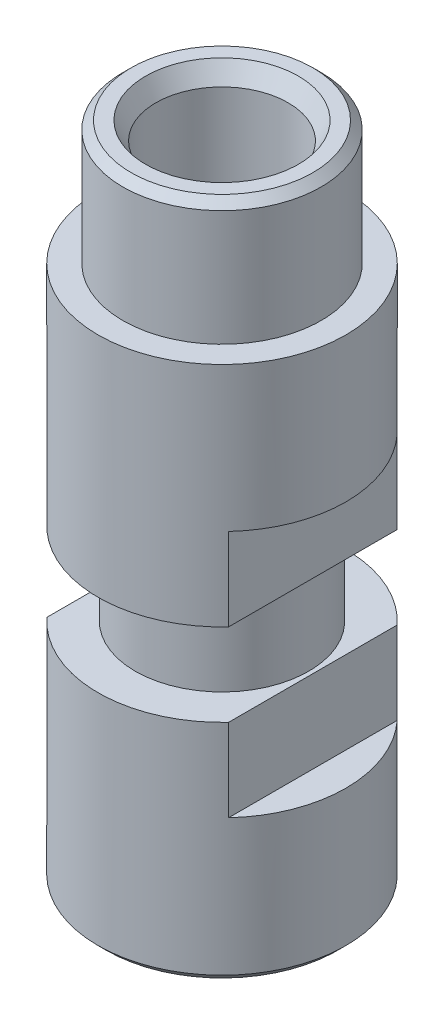
ISO-10303-21;
HEADER;
FILE_DESCRIPTION(('STEP AP214'),'2;1');
FILE_NAME('part.step','',(''),(''),'','','');
FILE_SCHEMA(('AUTOMOTIVE_DESIGN { 1 0 10303 214 1 1 1 1 }'));
ENDSEC;
DATA;
#1=APPLICATION_CONTEXT('core data for automotive mechanical design processes');
#2=APPLICATION_PROTOCOL_DEFINITION('international standard','automotive_design',2000,#1);
#3=PRODUCT_CONTEXT('',#1,'mechanical');
#4=PRODUCT('Part','Part','',(#3));
#5=PRODUCT_RELATED_PRODUCT_CATEGORY('part','',(#4));
#6=PRODUCT_DEFINITION_FORMATION('','',#4);
#7=PRODUCT_DEFINITION_CONTEXT('part definition',#1,'design');
#8=PRODUCT_DEFINITION('design','',#6,#7);
#9=PRODUCT_DEFINITION_SHAPE('','',#8);
#10=(LENGTH_UNIT() NAMED_UNIT(*) SI_UNIT(.MILLI.,.METRE.));
#11=(NAMED_UNIT(*) PLANE_ANGLE_UNIT() SI_UNIT($,.RADIAN.));
#12=(NAMED_UNIT(*) SI_UNIT($,.STERADIAN.) SOLID_ANGLE_UNIT());
#13=UNCERTAINTY_MEASURE_WITH_UNIT(LENGTH_MEASURE(1.E-05),#10,'distance_accuracy_value','');
#14=(GEOMETRIC_REPRESENTATION_CONTEXT(3) GLOBAL_UNCERTAINTY_ASSIGNED_CONTEXT((#13)) GLOBAL_UNIT_ASSIGNED_CONTEXT((#10,
#11,#12)) REPRESENTATION_CONTEXT('',''));
#15=CARTESIAN_POINT('',(0.,0.,0.));
#16=DIRECTION('',(0.,0.,1.));
#17=DIRECTION('',(1.,0.,0.));
#18=AXIS2_PLACEMENT_3D('',#15,#16,#17);
#19=CARTESIAN_POINT('',(-3.,0.,0.));
#20=DIRECTION('',(0.,1.,0.));
#21=DIRECTION('',(0.,0.,1.));
#22=AXIS2_PLACEMENT_3D('',#19,#20,#21);
#23=PLANE('',#22);
#24=CARTESIAN_POINT('',(0.,0.,0.));
#25=DIRECTION('',(0.,1.,0.));
#26=DIRECTION('',(0.,0.,1.));
#27=AXIS2_PLACEMENT_3D('',#24,#25,#26);
#28=CIRCLE('',#27,2.8);
#29=CARTESIAN_POINT('',(0.,0.,2.8));
#30=VERTEX_POINT('',#29);
#31=EDGE_CURVE('E143',#30,#30,#28,.F.);
#32=ORIENTED_EDGE('',*,*,#31,.T.);
#33=EDGE_LOOP('',(#32));
#34=FACE_BOUND('',#33,.T.);
#35=CARTESIAN_POINT('',(0.,0.,0.));
#36=DIRECTION('',(0.,-1.,0.));
#37=DIRECTION('',(0.,0.,-1.));
#38=AXIS2_PLACEMENT_3D('',#35,#36,#37);
#39=CIRCLE('',#38,1.6);
#40=CARTESIAN_POINT('',(0.,0.,-1.6));
#41=VERTEX_POINT('',#40);
#42=EDGE_CURVE('E146',#41,#41,#39,.T.);
#43=ORIENTED_EDGE('',*,*,#42,.F.);
#44=EDGE_LOOP('',(#43));
#45=FACE_BOUND('',#44,.T.);
#46=ADVANCED_FACE('F34',(#34,#45),#23,.F.);
#47=CARTESIAN_POINT('',(0.,0.,0.));
#48=DIRECTION('',(0.,-1.,0.));
#49=DIRECTION('',(0.,0.,-1.));
#50=AXIS2_PLACEMENT_3D('',#47,#48,#49);
#51=CYLINDRICAL_SURFACE('',#50,1.6);
#52=CARTESIAN_POINT('',(0.,15.5669872981078,0.));
#53=DIRECTION('',(0.,-1.,0.));
#54=DIRECTION('',(0.,0.,-1.));
#55=AXIS2_PLACEMENT_3D('',#52,#53,#54);
#56=CIRCLE('',#55,1.6);
#57=CARTESIAN_POINT('',(0.,15.5669872981078,-1.6));
#58=VERTEX_POINT('',#57);
#59=EDGE_CURVE('E128',#58,#58,#56,.F.);
#60=ORIENTED_EDGE('',*,*,#59,.T.);
#61=EDGE_LOOP('',(#60));
#62=FACE_BOUND('',#61,.T.);
#63=ORIENTED_EDGE('',*,*,#42,.T.);
#64=EDGE_LOOP('',(#63));
#65=FACE_BOUND('',#64,.T.);
#66=ADVANCED_FACE('F222',(#62,#65),#51,.F.);
#67=CARTESIAN_POINT('',(-1.6,16.,0.));
#68=DIRECTION('',(0.,-1.,0.));
#69=DIRECTION('',(0.,0.,-1.));
#70=AXIS2_PLACEMENT_3D('',#67,#68,#69);
#71=PLANE('',#70);
#72=CARTESIAN_POINT('',(0.,16.,0.));
#73=DIRECTION('',(0.,-1.,0.));
#74=DIRECTION('',(0.,0.,-1.));
#75=AXIS2_PLACEMENT_3D('',#72,#73,#74);
#76=CIRCLE('',#75,1.85);
#77=CARTESIAN_POINT('',(0.,16.,-1.85));
#78=VERTEX_POINT('',#77);
#79=EDGE_CURVE('E131',#78,#78,#76,.T.);
#80=ORIENTED_EDGE('',*,*,#79,.T.);
#81=EDGE_LOOP('',(#80));
#82=FACE_BOUND('',#81,.T.);
#83=CARTESIAN_POINT('',(0.,16.,0.));
#84=DIRECTION('',(0.,-1.,0.));
#85=DIRECTION('',(0.,0.,-1.));
#86=AXIS2_PLACEMENT_3D('',#83,#84,#85);
#87=CIRCLE('',#86,2.2);
#88=CARTESIAN_POINT('',(0.,16.,-2.2));
#89=VERTEX_POINT('',#88);
#90=EDGE_CURVE('E134',#89,#89,#87,.F.);
#91=ORIENTED_EDGE('',*,*,#90,.T.);
#92=EDGE_LOOP('',(#91));
#93=FACE_BOUND('',#92,.T.);
#94=ADVANCED_FACE('F228',(#82,#93),#71,.F.);
#95=CARTESIAN_POINT('',(0.,0.,0.));
#96=DIRECTION('',(0.,-1.,0.));
#97=DIRECTION('',(0.,0.,-1.));
#98=AXIS2_PLACEMENT_3D('',#95,#96,#97);
#99=CYLINDRICAL_SURFACE('',#98,2.4);
#100=CARTESIAN_POINT('',(0.,15.8,0.));
#101=DIRECTION('',(0.,-1.,0.));
#102=DIRECTION('',(0.,0.,-1.));
#103=AXIS2_PLACEMENT_3D('',#100,#101,#102);
#104=CIRCLE('',#103,2.4);
#105=CARTESIAN_POINT('',(0.,15.8,-2.4));
#106=VERTEX_POINT('',#105);
#107=EDGE_CURVE('E137',#106,#106,#104,.T.);
#108=ORIENTED_EDGE('',*,*,#107,.T.);
#109=EDGE_LOOP('',(#108));
#110=FACE_BOUND('',#109,.T.);
#111=CARTESIAN_POINT('',(0.,13.,0.));
#112=DIRECTION('',(0.,-1.,0.));
#113=DIRECTION('',(0.,0.,-1.));
#114=AXIS2_PLACEMENT_3D('',#111,#112,#113);
#115=CIRCLE('',#114,2.4);
#116=CARTESIAN_POINT('',(0.,13.,-2.4));
#117=VERTEX_POINT('',#116);
#118=EDGE_CURVE('E149',#117,#117,#115,.T.);
#119=ORIENTED_EDGE('',*,*,#118,.F.);
#120=EDGE_LOOP('',(#119));
#121=FACE_BOUND('',#120,.T.);
#122=ADVANCED_FACE('F248',(#110,#121),#99,.T.);
#123=CARTESIAN_POINT('',(-2.4,13.,0.));
#124=DIRECTION('',(0.,-1.,0.));
#125=DIRECTION('',(0.,0.,-1.));
#126=AXIS2_PLACEMENT_3D('',#123,#124,#125);
#127=PLANE('',#126);
#128=CARTESIAN_POINT('',(0.,13.,0.));
#129=DIRECTION('',(0.,-1.,0.));
#130=DIRECTION('',(0.,0.,-1.));
#131=AXIS2_PLACEMENT_3D('',#128,#129,#130);
#132=CIRCLE('',#131,3.);
#133=CARTESIAN_POINT('',(0.,13.,-3.));
#134=VERTEX_POINT('',#133);
#135=EDGE_CURVE('E152',#134,#134,#132,.T.);
#136=ORIENTED_EDGE('',*,*,#135,.F.);
#137=EDGE_LOOP('',(#136));
#138=FACE_BOUND('',#137,.T.);
#139=ORIENTED_EDGE('',*,*,#118,.T.);
#140=EDGE_LOOP('',(#139));
#141=FACE_BOUND('',#140,.T.);
#142=ADVANCED_FACE('F251',(#138,#141),#127,.F.);
#143=CARTESIAN_POINT('',(0.,0.,0.));
#144=DIRECTION('',(0.,-1.,0.));
#145=DIRECTION('',(0.,0.,-1.));
#146=AXIS2_PLACEMENT_3D('',#143,#144,#145);
#147=CYLINDRICAL_SURFACE('',#146,3.);
#148=CARTESIAN_POINT('',(0.,7.5,0.));
#149=DIRECTION('',(0.,-1.,0.));
#150=DIRECTION('',(0.,0.,-1.));
#151=AXIS2_PLACEMENT_3D('',#148,#149,#150);
#152=CIRCLE('',#151,3.);
#153=CARTESIAN_POINT('',(2.2,7.5,2.03960780543711));
#154=VERTEX_POINT('',#153);
#155=CARTESIAN_POINT('',(-2.2,7.5,2.03960780543711));
#156=VERTEX_POINT('',#155);
#157=EDGE_CURVE('E158',#154,#156,#152,.T.);
#158=ORIENTED_EDGE('',*,*,#157,.F.);
#159=DIRECTION('',(0.,-1.,0.));
#160=VECTOR('',#159,1.);
#161=CARTESIAN_POINT('',(2.2,0.,2.03960780543711));
#162=LINE('',#161,#160);
#163=CARTESIAN_POINT('',(2.2,9.5,2.03960780543711));
#164=VERTEX_POINT('',#163);
#165=EDGE_CURVE('E49',#154,#164,#162,.F.);
#166=ORIENTED_EDGE('',*,*,#165,.T.);
#167=CARTESIAN_POINT('',(0.,9.5,0.));
#168=DIRECTION('',(0.,1.,0.));
#169=DIRECTION('',(0.,0.,1.));
#170=AXIS2_PLACEMENT_3D('',#167,#168,#169);
#171=CIRCLE('',#170,3.);
#172=CARTESIAN_POINT('',(2.2,9.5,-2.03960780543711));
#173=VERTEX_POINT('',#172);
#174=EDGE_CURVE('E11',#164,#173,#171,.T.);
#175=ORIENTED_EDGE('',*,*,#174,.T.);
#176=DIRECTION('',(0.,-1.,0.));
#177=VECTOR('',#176,1.);
#178=CARTESIAN_POINT('',(2.2,0.,-2.03960780543711));
#179=LINE('',#178,#177);
#180=CARTESIAN_POINT('',(2.2,7.5,-2.03960780543711));
#181=VERTEX_POINT('',#180);
#182=EDGE_CURVE('E183',#173,#181,#179,.T.);
#183=ORIENTED_EDGE('',*,*,#182,.T.);
#184=CARTESIAN_POINT('',(-2.2,7.5,-2.03960780543711));
#185=VERTEX_POINT('',#184);
#186=EDGE_CURVE('E155',#185,#181,#152,.T.);
#187=ORIENTED_EDGE('',*,*,#186,.F.);
#188=DIRECTION('',(0.,-1.,0.));
#189=VECTOR('',#188,1.);
#190=CARTESIAN_POINT('',(-2.2,0.,-2.03960780543711));
#191=LINE('',#190,#189);
#192=CARTESIAN_POINT('',(-2.2,9.5,-2.03960780543711));
#193=VERTEX_POINT('',#192);
#194=EDGE_CURVE('E170',#185,#193,#191,.F.);
#195=ORIENTED_EDGE('',*,*,#194,.T.);
#196=CARTESIAN_POINT('',(0.,9.5,0.));
#197=DIRECTION('',(0.,1.,0.));
#198=DIRECTION('',(0.,0.,1.));
#199=AXIS2_PLACEMENT_3D('',#196,#197,#198);
#200=CIRCLE('',#199,3.);
#201=CARTESIAN_POINT('',(-2.2,9.5,2.03960780543711));
#202=VERTEX_POINT('',#201);
#203=EDGE_CURVE('E104',#193,#202,#200,.T.);
#204=ORIENTED_EDGE('',*,*,#203,.T.);
#205=DIRECTION('',(0.,-1.,0.));
#206=VECTOR('',#205,1.);
#207=CARTESIAN_POINT('',(-2.2,0.,2.03960780543711));
#208=LINE('',#207,#206);
#209=EDGE_CURVE('E167',#202,#156,#208,.T.);
#210=ORIENTED_EDGE('',*,*,#209,.T.);
#211=EDGE_LOOP('',(#158,#166,#175,#183,#187,#195,#204,#210));
#212=FACE_BOUND('',#211,.T.);
#213=ORIENTED_EDGE('',*,*,#135,.T.);
#214=EDGE_LOOP('',(#213));
#215=FACE_BOUND('',#214,.T.);
#216=ADVANCED_FACE('F198',(#212,#215),#147,.T.);
#217=CARTESIAN_POINT('',(-3.,7.5,0.));
#218=DIRECTION('',(0.,1.,0.));
#219=DIRECTION('',(0.,0.,1.));
#220=AXIS2_PLACEMENT_3D('',#217,#218,#219);
#221=PLANE('',#220);
#222=CARTESIAN_POINT('',(0.,7.5,0.));
#223=DIRECTION('',(0.,-1.,0.));
#224=DIRECTION('',(0.,0.,-1.));
#225=AXIS2_PLACEMENT_3D('',#222,#223,#224);
#226=CIRCLE('',#225,2.1);
#227=CARTESIAN_POINT('',(0.,7.5,-2.1));
#228=VERTEX_POINT('',#227);
#229=EDGE_CURVE('E159',#228,#228,#226,.T.);
#230=ORIENTED_EDGE('',*,*,#229,.F.);
#231=EDGE_LOOP('',(#230));
#232=FACE_BOUND('',#231,.T.);
#233=ORIENTED_EDGE('',*,*,#186,.T.);
#234=DIRECTION('',(0.,0.,1.));
#235=VECTOR('',#234,1.);
#236=CARTESIAN_POINT('',(2.2,7.5,0.));
#237=LINE('',#236,#235);
#238=EDGE_CURVE('E189',#181,#154,#237,.T.);
#239=ORIENTED_EDGE('',*,*,#238,.T.);
#240=ORIENTED_EDGE('',*,*,#157,.T.);
#241=DIRECTION('',(0.,0.,-1.));
#242=VECTOR('',#241,1.);
#243=CARTESIAN_POINT('',(-2.2,7.5,0.));
#244=LINE('',#243,#242);
#245=EDGE_CURVE('E173',#156,#185,#244,.T.);
#246=ORIENTED_EDGE('',*,*,#245,.T.);
#247=EDGE_LOOP('',(#233,#239,#240,#246));
#248=FACE_BOUND('',#247,.T.);
#249=ADVANCED_FACE('F203',(#232,#248),#221,.F.);
#250=CARTESIAN_POINT('',(0.,0.,0.));
#251=DIRECTION('',(0.,-1.,0.));
#252=DIRECTION('',(0.,0.,-1.));
#253=AXIS2_PLACEMENT_3D('',#250,#251,#252);
#254=CYLINDRICAL_SURFACE('',#253,2.1);
#255=CARTESIAN_POINT('',(0.,5.5,0.));
#256=DIRECTION('',(0.,-1.,0.));
#257=DIRECTION('',(0.,0.,-1.));
#258=AXIS2_PLACEMENT_3D('',#255,#256,#257);
#259=CIRCLE('',#258,2.1);
#260=CARTESIAN_POINT('',(0.,5.5,-2.1));
#261=VERTEX_POINT('',#260);
#262=EDGE_CURVE('E162',#261,#261,#259,.T.);
#263=ORIENTED_EDGE('',*,*,#262,.F.);
#264=EDGE_LOOP('',(#263));
#265=FACE_BOUND('',#264,.T.);
#266=ORIENTED_EDGE('',*,*,#229,.T.);
#267=EDGE_LOOP('',(#266));
#268=FACE_BOUND('',#267,.T.);
#269=ADVANCED_FACE('F381',(#265,#268),#254,.T.);
#270=CARTESIAN_POINT('',(-2.1,5.5,0.));
#271=DIRECTION('',(0.,-1.,0.));
#272=DIRECTION('',(0.,0.,-1.));
#273=AXIS2_PLACEMENT_3D('',#270,#271,#272);
#274=PLANE('',#273);
#275=CARTESIAN_POINT('',(0.,5.5,0.));
#276=DIRECTION('',(0.,-1.,0.));
#277=DIRECTION('',(0.,0.,-1.));
#278=AXIS2_PLACEMENT_3D('',#275,#276,#277);
#279=CIRCLE('',#278,3.);
#280=CARTESIAN_POINT('',(2.2,5.5,2.03960780543711));
#281=VERTEX_POINT('',#280);
#282=CARTESIAN_POINT('',(-2.2,5.5,2.03960780543711));
#283=VERTEX_POINT('',#282);
#284=EDGE_CURVE('E166',#281,#283,#279,.T.);
#285=ORIENTED_EDGE('',*,*,#284,.F.);
#286=DIRECTION('',(0.,0.,-1.));
#287=VECTOR('',#286,1.);
#288=CARTESIAN_POINT('',(2.2,5.5,0.));
#289=LINE('',#288,#287);
#290=CARTESIAN_POINT('',(2.2,5.5,-2.03960780543711));
#291=VERTEX_POINT('',#290);
#292=EDGE_CURVE('E191',#281,#291,#289,.T.);
#293=ORIENTED_EDGE('',*,*,#292,.T.);
#294=CARTESIAN_POINT('',(-2.2,5.5,-2.03960780543711));
#295=VERTEX_POINT('',#294);
#296=EDGE_CURVE('E116',#295,#291,#279,.T.);
#297=ORIENTED_EDGE('',*,*,#296,.F.);
#298=DIRECTION('',(0.,0.,1.));
#299=VECTOR('',#298,1.);
#300=CARTESIAN_POINT('',(-2.2,5.5,0.));
#301=LINE('',#300,#299);
#302=EDGE_CURVE('E176',#295,#283,#301,.T.);
#303=ORIENTED_EDGE('',*,*,#302,.T.);
#304=EDGE_LOOP('',(#285,#293,#297,#303));
#305=FACE_BOUND('',#304,.T.);
#306=ORIENTED_EDGE('',*,*,#262,.T.);
#307=EDGE_LOOP('',(#306));
#308=FACE_BOUND('',#307,.T.);
#309=ADVANCED_FACE('F372',(#305,#308),#274,.F.);
#310=CARTESIAN_POINT('',(0.,0.,0.));
#311=DIRECTION('',(0.,-1.,0.));
#312=DIRECTION('',(0.,0.,-1.));
#313=AXIS2_PLACEMENT_3D('',#310,#311,#312);
#314=CYLINDRICAL_SURFACE('',#313,3.);
#315=ORIENTED_EDGE('',*,*,#296,.T.);
#316=DIRECTION('',(0.,-1.,0.));
#317=VECTOR('',#316,1.);
#318=CARTESIAN_POINT('',(2.2,0.,-2.03960780543711));
#319=LINE('',#318,#317);
#320=CARTESIAN_POINT('',(2.2,3.5,-2.03960780543711));
#321=VERTEX_POINT('',#320);
#322=EDGE_CURVE('E42',#291,#321,#319,.T.);
#323=ORIENTED_EDGE('',*,*,#322,.T.);
#324=CARTESIAN_POINT('',(0.,3.5,0.));
#325=DIRECTION('',(0.,-1.,0.));
#326=DIRECTION('',(0.,0.,-1.));
#327=AXIS2_PLACEMENT_3D('',#324,#325,#326);
#328=CIRCLE('',#327,3.);
#329=CARTESIAN_POINT('',(2.2,3.5,2.03960780543711));
#330=VERTEX_POINT('',#329);
#331=EDGE_CURVE('E98',#321,#330,#328,.T.);
#332=ORIENTED_EDGE('',*,*,#331,.T.);
#333=DIRECTION('',(0.,-1.,0.));
#334=VECTOR('',#333,1.);
#335=CARTESIAN_POINT('',(2.2,0.,2.03960780543711));
#336=LINE('',#335,#334);
#337=EDGE_CURVE('E103',#330,#281,#336,.F.);
#338=ORIENTED_EDGE('',*,*,#337,.T.);
#339=ORIENTED_EDGE('',*,*,#284,.T.);
#340=DIRECTION('',(0.,-1.,0.));
#341=VECTOR('',#340,1.);
#342=CARTESIAN_POINT('',(-2.2,0.,2.03960780543711));
#343=LINE('',#342,#341);
#344=CARTESIAN_POINT('',(-2.2,3.5,2.03960780543711));
#345=VERTEX_POINT('',#344);
#346=EDGE_CURVE('E120',#283,#345,#343,.T.);
#347=ORIENTED_EDGE('',*,*,#346,.T.);
#348=CARTESIAN_POINT('',(0.,3.5,0.));
#349=DIRECTION('',(0.,-1.,0.));
#350=DIRECTION('',(0.,0.,-1.));
#351=AXIS2_PLACEMENT_3D('',#348,#349,#350);
#352=CIRCLE('',#351,3.);
#353=CARTESIAN_POINT('',(-2.2,3.5,-2.03960780543711));
#354=VERTEX_POINT('',#353);
#355=EDGE_CURVE('E125',#345,#354,#352,.T.);
#356=ORIENTED_EDGE('',*,*,#355,.T.);
#357=DIRECTION('',(0.,-1.,0.));
#358=VECTOR('',#357,1.);
#359=CARTESIAN_POINT('',(-2.2,0.,-2.03960780543711));
#360=LINE('',#359,#358);
#361=EDGE_CURVE('E123',#354,#295,#360,.F.);
#362=ORIENTED_EDGE('',*,*,#361,.T.);
#363=EDGE_LOOP('',(#315,#323,#332,#338,#339,#347,#356,#362));
#364=FACE_BOUND('',#363,.T.);
#365=CARTESIAN_POINT('',(0.,0.200000000000001,0.));
#366=DIRECTION('',(0.,1.,0.));
#367=DIRECTION('',(0.,0.,1.));
#368=AXIS2_PLACEMENT_3D('',#365,#366,#367);
#369=CIRCLE('',#368,3.);
#370=CARTESIAN_POINT('',(0.,0.200000000000001,3.));
#371=VERTEX_POINT('',#370);
#372=EDGE_CURVE('E140',#371,#371,#369,.T.);
#373=ORIENTED_EDGE('',*,*,#372,.T.);
#374=EDGE_LOOP('',(#373));
#375=FACE_BOUND('',#374,.T.);
#376=ADVANCED_FACE('F112',(#364,#375),#314,.T.);
#377=CARTESIAN_POINT('',(0.,0.,0.));
#378=DIRECTION('',(0.,1.,0.));
#379=DIRECTION('',(0.,0.,1.));
#380=AXIS2_PLACEMENT_3D('',#377,#378,#379);
#381=CONICAL_SURFACE('',#380,2.8,0.785398163397448);
#382=ORIENTED_EDGE('',*,*,#372,.F.);
#383=EDGE_LOOP('',(#382));
#384=FACE_BOUND('',#383,.T.);
#385=ORIENTED_EDGE('',*,*,#31,.F.);
#386=EDGE_LOOP('',(#385));
#387=FACE_BOUND('',#386,.T.);
#388=ADVANCED_FACE('F234',(#384,#387),#381,.T.);
#389=CARTESIAN_POINT('',(0.,15.8,0.));
#390=DIRECTION('',(0.,-1.,0.));
#391=DIRECTION('',(0.,0.,-1.));
#392=AXIS2_PLACEMENT_3D('',#389,#390,#391);
#393=CONICAL_SURFACE('',#392,2.4,0.785398163397447);
#394=ORIENTED_EDGE('',*,*,#90,.F.);
#395=EDGE_LOOP('',(#394));
#396=FACE_BOUND('',#395,.T.);
#397=ORIENTED_EDGE('',*,*,#107,.F.);
#398=EDGE_LOOP('',(#397));
#399=FACE_BOUND('',#398,.T.);
#400=ADVANCED_FACE('F236',(#396,#399),#393,.T.);
#401=CARTESIAN_POINT('',(0.,16.,0.));
#402=DIRECTION('',(0.,1.,0.));
#403=DIRECTION('',(0.,0.,1.));
#404=AXIS2_PLACEMENT_3D('',#401,#402,#403);
#405=CONICAL_SURFACE('',#404,1.85,0.523598775598298);
#406=ORIENTED_EDGE('',*,*,#59,.F.);
#407=EDGE_LOOP('',(#406));
#408=FACE_BOUND('',#407,.T.);
#409=ORIENTED_EDGE('',*,*,#79,.F.);
#410=EDGE_LOOP('',(#409));
#411=FACE_BOUND('',#410,.T.);
#412=ADVANCED_FACE('F36',(#408,#411),#405,.F.);
#413=CARTESIAN_POINT('',(-3.,3.5,-3.));
#414=DIRECTION('',(0.,-1.,0.));
#415=DIRECTION('',(0.,0.,-1.));
#416=AXIS2_PLACEMENT_3D('',#413,#414,#415);
#417=PLANE('',#416);
#418=DIRECTION('',(0.,0.,1.));
#419=VECTOR('',#418,1.);
#420=CARTESIAN_POINT('',(-2.2,3.5,-3.));
#421=LINE('',#420,#419);
#422=EDGE_CURVE('E180',#354,#345,#421,.T.);
#423=ORIENTED_EDGE('',*,*,#422,.F.);
#424=ORIENTED_EDGE('',*,*,#355,.F.);
#425=EDGE_LOOP('',(#423,#424));
#426=FACE_BOUND('',#425,.T.);
#427=ADVANCED_FACE('F218',(#426),#417,.F.);
#428=CARTESIAN_POINT('',(-2.2,9.5,-3.));
#429=DIRECTION('',(1.,0.,0.));
#430=DIRECTION('',(0.,0.,-1.));
#431=AXIS2_PLACEMENT_3D('',#428,#429,#430);
#432=PLANE('',#431);
#433=ORIENTED_EDGE('',*,*,#302,.F.);
#434=ORIENTED_EDGE('',*,*,#361,.F.);
#435=ORIENTED_EDGE('',*,*,#422,.T.);
#436=ORIENTED_EDGE('',*,*,#346,.F.);
#437=EDGE_LOOP('',(#433,#434,#435,#436));
#438=FACE_BOUND('',#437,.T.);
#439=ADVANCED_FACE('F211',(#438),#432,.F.);
#440=CARTESIAN_POINT('',(-3.,9.5,-3.));
#441=DIRECTION('',(0.,1.,0.));
#442=DIRECTION('',(0.,0.,1.));
#443=AXIS2_PLACEMENT_3D('',#440,#441,#442);
#444=PLANE('',#443);
#445=DIRECTION('',(0.,0.,1.));
#446=VECTOR('',#445,1.);
#447=CARTESIAN_POINT('',(-2.2,9.5,-3.));
#448=LINE('',#447,#446);
#449=EDGE_CURVE('E179',#193,#202,#448,.T.);
#450=ORIENTED_EDGE('',*,*,#449,.T.);
#451=ORIENTED_EDGE('',*,*,#203,.F.);
#452=EDGE_LOOP('',(#450,#451));
#453=FACE_BOUND('',#452,.T.);
#454=ADVANCED_FACE('F209',(#453),#444,.F.);
#455=ORIENTED_EDGE('',*,*,#449,.F.);
#456=ORIENTED_EDGE('',*,*,#194,.F.);
#457=ORIENTED_EDGE('',*,*,#245,.F.);
#458=ORIENTED_EDGE('',*,*,#209,.F.);
#459=EDGE_LOOP('',(#455,#456,#457,#458));
#460=FACE_BOUND('',#459,.T.);
#461=ADVANCED_FACE('F207',(#460),#432,.F.);
#462=CARTESIAN_POINT('',(2.2,3.5,-3.));
#463=DIRECTION('',(0.,-1.,0.));
#464=DIRECTION('',(0.,0.,-1.));
#465=AXIS2_PLACEMENT_3D('',#462,#463,#464);
#466=PLANE('',#465);
#467=DIRECTION('',(0.,0.,1.));
#468=VECTOR('',#467,1.);
#469=CARTESIAN_POINT('',(2.2,3.5,-3.));
#470=LINE('',#469,#468);
#471=EDGE_CURVE('E56',#321,#330,#470,.T.);
#472=ORIENTED_EDGE('',*,*,#471,.T.);
#473=ORIENTED_EDGE('',*,*,#331,.F.);
#474=EDGE_LOOP('',(#472,#473));
#475=FACE_BOUND('',#474,.T.);
#476=ADVANCED_FACE('F99',(#475),#466,.F.);
#477=CARTESIAN_POINT('',(2.2,9.5,-3.));
#478=DIRECTION('',(-1.,0.,0.));
#479=DIRECTION('',(0.,0.,1.));
#480=AXIS2_PLACEMENT_3D('',#477,#478,#479);
#481=PLANE('',#480);
#482=ORIENTED_EDGE('',*,*,#292,.F.);
#483=ORIENTED_EDGE('',*,*,#337,.F.);
#484=ORIENTED_EDGE('',*,*,#471,.F.);
#485=ORIENTED_EDGE('',*,*,#322,.F.);
#486=EDGE_LOOP('',(#482,#483,#484,#485));
#487=FACE_BOUND('',#486,.T.);
#488=ADVANCED_FACE('F107',(#487),#481,.F.);
#489=CARTESIAN_POINT('',(2.2,9.5,-3.));
#490=DIRECTION('',(0.,1.,0.));
#491=DIRECTION('',(0.,0.,1.));
#492=AXIS2_PLACEMENT_3D('',#489,#490,#491);
#493=PLANE('',#492);
#494=DIRECTION('',(0.,0.,1.));
#495=VECTOR('',#494,1.);
#496=CARTESIAN_POINT('',(2.2,9.5,-3.));
#497=LINE('',#496,#495);
#498=EDGE_CURVE('E109',#173,#164,#497,.T.);
#499=ORIENTED_EDGE('',*,*,#498,.F.);
#500=ORIENTED_EDGE('',*,*,#174,.F.);
#501=EDGE_LOOP('',(#499,#500));
#502=FACE_BOUND('',#501,.T.);
#503=ADVANCED_FACE('F347',(#502),#493,.F.);
#504=ORIENTED_EDGE('',*,*,#498,.T.);
#505=ORIENTED_EDGE('',*,*,#165,.F.);
#506=ORIENTED_EDGE('',*,*,#238,.F.);
#507=ORIENTED_EDGE('',*,*,#182,.F.);
#508=EDGE_LOOP('',(#504,#505,#506,#507));
#509=FACE_BOUND('',#508,.T.);
#510=ADVANCED_FACE('F194',(#509),#481,.F.);
#511=CLOSED_SHELL('',(#46,#66,#94,#122,#142,#216,#249,#269,#309,#376,#388,#400,#412,#427,#439,
#454,#461,#476,#488,#503,#510));
#512=MANIFOLD_SOLID_BREP('B2',#511);
#513=ADVANCED_BREP_SHAPE_REPRESENTATION('',(#18,#512),#14);
#514=SHAPE_DEFINITION_REPRESENTATION(#9,#513);
ENDSEC;
END-ISO-10303-21;
